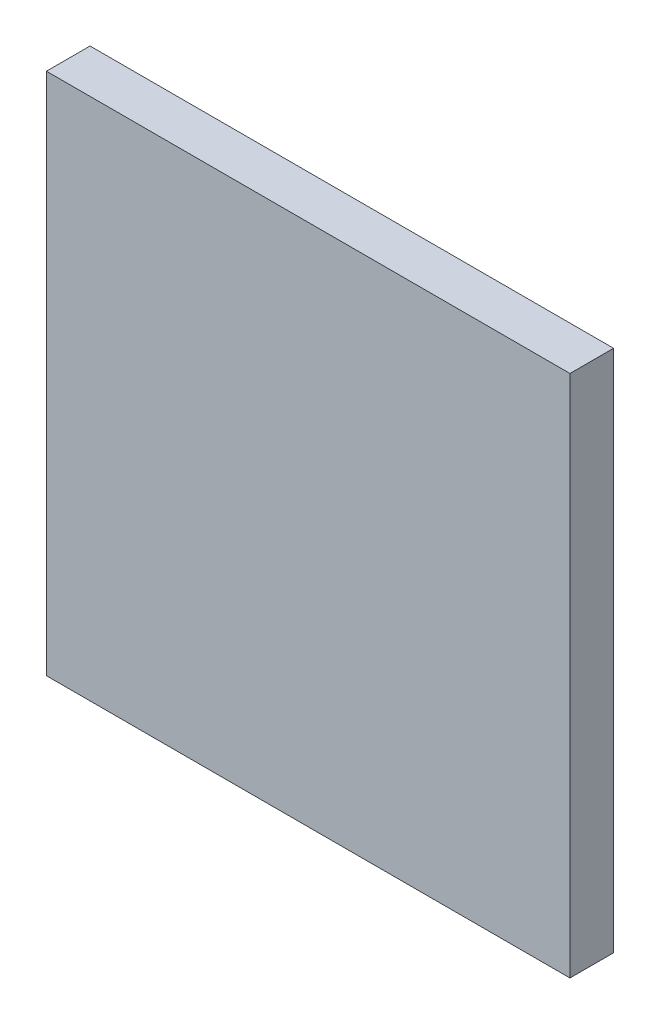
ISO-10303-21;
HEADER;
FILE_DESCRIPTION(('STEP AP214'),'2;1');
FILE_NAME('part.step','',(''),(''),'','','');
FILE_SCHEMA(('AUTOMOTIVE_DESIGN { 1 0 10303 214 1 1 1 1 }'));
ENDSEC;
DATA;
#1=APPLICATION_CONTEXT('core data for automotive mechanical design processes');
#2=APPLICATION_PROTOCOL_DEFINITION('international standard','automotive_design',2000,#1);
#3=PRODUCT_CONTEXT('',#1,'mechanical');
#4=PRODUCT('Part','Part','',(#3));
#5=PRODUCT_RELATED_PRODUCT_CATEGORY('part','',(#4));
#6=PRODUCT_DEFINITION_FORMATION('','',#4);
#7=PRODUCT_DEFINITION_CONTEXT('part definition',#1,'design');
#8=PRODUCT_DEFINITION('design','',#6,#7);
#9=PRODUCT_DEFINITION_SHAPE('','',#8);
#10=(LENGTH_UNIT() NAMED_UNIT(*) SI_UNIT(.MILLI.,.METRE.));
#11=(NAMED_UNIT(*) PLANE_ANGLE_UNIT() SI_UNIT($,.RADIAN.));
#12=(NAMED_UNIT(*) SI_UNIT($,.STERADIAN.) SOLID_ANGLE_UNIT());
#13=UNCERTAINTY_MEASURE_WITH_UNIT(LENGTH_MEASURE(1.E-05),#10,'distance_accuracy_value','');
#14=(GEOMETRIC_REPRESENTATION_CONTEXT(3) GLOBAL_UNCERTAINTY_ASSIGNED_CONTEXT((#13)) GLOBAL_UNIT_ASSIGNED_CONTEXT((#10,
#11,#12)) REPRESENTATION_CONTEXT('',''));
#15=CARTESIAN_POINT('',(0.,0.,0.));
#16=DIRECTION('',(0.,0.,1.));
#17=DIRECTION('',(1.,0.,0.));
#18=AXIS2_PLACEMENT_3D('',#15,#16,#17);
#19=CARTESIAN_POINT('',(0.,0.,-0.5));
#20=DIRECTION('',(-1.,0.,0.));
#21=DIRECTION('',(0.,0.,1.));
#22=AXIS2_PLACEMENT_3D('',#19,#20,#21);
#23=PLANE('',#22);
#24=DIRECTION('',(0.,-1.,0.));
#25=VECTOR('',#24,1.);
#26=CARTESIAN_POINT('',(0.,0.,0.));
#27=LINE('',#26,#25);
#28=CARTESIAN_POINT('',(0.,6.00000000000001,0.));
#29=VERTEX_POINT('',#28);
#30=CARTESIAN_POINT('',(0.,0.,0.));
#31=VERTEX_POINT('',#30);
#32=EDGE_CURVE('E103',#29,#31,#27,.T.);
#33=ORIENTED_EDGE('',*,*,#32,.F.);
#34=DIRECTION('',(0.,0.,1.));
#35=VECTOR('',#34,1.);
#36=CARTESIAN_POINT('',(0.,6.00000000000001,-0.5));
#37=LINE('',#36,#35);
#38=CARTESIAN_POINT('',(0.,6.00000000000001,-0.5));
#39=VERTEX_POINT('',#38);
#40=EDGE_CURVE('E11',#39,#29,#37,.T.);
#41=ORIENTED_EDGE('',*,*,#40,.F.);
#42=DIRECTION('',(0.,-1.,0.));
#43=VECTOR('',#42,1.);
#44=CARTESIAN_POINT('',(0.,0.,-0.5));
#45=LINE('',#44,#43);
#46=CARTESIAN_POINT('',(0.,0.,-0.5));
#47=VERTEX_POINT('',#46);
#48=EDGE_CURVE('E97',#39,#47,#45,.T.);
#49=ORIENTED_EDGE('',*,*,#48,.T.);
#50=DIRECTION('',(0.,0.,1.));
#51=VECTOR('',#50,1.);
#52=CARTESIAN_POINT('',(0.,0.,-0.5));
#53=LINE('',#52,#51);
#54=EDGE_CURVE('E42',#47,#31,#53,.T.);
#55=ORIENTED_EDGE('',*,*,#54,.T.);
#56=EDGE_LOOP('',(#33,#41,#49,#55));
#57=FACE_BOUND('',#56,.T.);
#58=ADVANCED_FACE('F39',(#57),#23,.T.);
#59=CARTESIAN_POINT('',(0.,6.00000000000001,-0.5));
#60=DIRECTION('',(0.,1.,0.));
#61=DIRECTION('',(0.,0.,1.));
#62=AXIS2_PLACEMENT_3D('',#59,#60,#61);
#63=PLANE('',#62);
#64=DIRECTION('',(-1.,0.,0.));
#65=VECTOR('',#64,1.);
#66=CARTESIAN_POINT('',(0.,6.00000000000001,0.));
#67=LINE('',#66,#65);
#68=CARTESIAN_POINT('',(6.,6.00000000000001,0.));
#69=VERTEX_POINT('',#68);
#70=EDGE_CURVE('E99',#69,#29,#67,.T.);
#71=ORIENTED_EDGE('',*,*,#70,.F.);
#72=DIRECTION('',(0.,0.,1.));
#73=VECTOR('',#72,1.);
#74=CARTESIAN_POINT('',(6.,6.00000000000001,-0.5));
#75=LINE('',#74,#73);
#76=CARTESIAN_POINT('',(6.,6.00000000000001,-0.5));
#77=VERTEX_POINT('',#76);
#78=EDGE_CURVE('E48',#77,#69,#75,.T.);
#79=ORIENTED_EDGE('',*,*,#78,.F.);
#80=DIRECTION('',(-1.,0.,0.));
#81=VECTOR('',#80,1.);
#82=CARTESIAN_POINT('',(0.,6.00000000000001,-0.5));
#83=LINE('',#82,#81);
#84=EDGE_CURVE('E94',#77,#39,#83,.T.);
#85=ORIENTED_EDGE('',*,*,#84,.T.);
#86=ORIENTED_EDGE('',*,*,#40,.T.);
#87=EDGE_LOOP('',(#71,#79,#85,#86));
#88=FACE_BOUND('',#87,.T.);
#89=ADVANCED_FACE('F113',(#88),#63,.T.);
#90=CARTESIAN_POINT('',(6.00000000000001,0.,-0.5));
#91=DIRECTION('',(1.,0.,0.));
#92=DIRECTION('',(0.,1.,0.));
#93=AXIS2_PLACEMENT_3D('',#90,#91,#92);
#94=PLANE('',#93);
#95=DIRECTION('',(0.,1.,0.));
#96=VECTOR('',#95,1.);
#97=CARTESIAN_POINT('',(6.00000000000001,0.,0.));
#98=LINE('',#97,#96);
#99=CARTESIAN_POINT('',(6.00000000000001,0.,0.));
#100=VERTEX_POINT('',#99);
#101=EDGE_CURVE('E89',#100,#69,#98,.T.);
#102=ORIENTED_EDGE('',*,*,#101,.F.);
#103=DIRECTION('',(0.,0.,1.));
#104=VECTOR('',#103,1.);
#105=CARTESIAN_POINT('',(6.00000000000001,0.,-0.5));
#106=LINE('',#105,#104);
#107=CARTESIAN_POINT('',(6.00000000000001,0.,-0.5));
#108=VERTEX_POINT('',#107);
#109=EDGE_CURVE('E84',#108,#100,#106,.T.);
#110=ORIENTED_EDGE('',*,*,#109,.F.);
#111=DIRECTION('',(0.,1.,0.));
#112=VECTOR('',#111,1.);
#113=CARTESIAN_POINT('',(6.00000000000001,0.,-0.5));
#114=LINE('',#113,#112);
#115=EDGE_CURVE('E87',#108,#77,#114,.T.);
#116=ORIENTED_EDGE('',*,*,#115,.T.);
#117=ORIENTED_EDGE('',*,*,#78,.T.);
#118=EDGE_LOOP('',(#102,#110,#116,#117));
#119=FACE_BOUND('',#118,.T.);
#120=ADVANCED_FACE('F86',(#119),#94,.T.);
#121=CARTESIAN_POINT('',(0.,0.,-0.5));
#122=DIRECTION('',(0.,-1.,0.));
#123=DIRECTION('',(0.,0.,-1.));
#124=AXIS2_PLACEMENT_3D('',#121,#122,#123);
#125=PLANE('',#124);
#126=DIRECTION('',(1.,0.,0.));
#127=VECTOR('',#126,1.);
#128=CARTESIAN_POINT('',(0.,0.,0.));
#129=LINE('',#128,#127);
#130=EDGE_CURVE('E106',#31,#100,#129,.T.);
#131=ORIENTED_EDGE('',*,*,#130,.F.);
#132=ORIENTED_EDGE('',*,*,#54,.F.);
#133=DIRECTION('',(1.,0.,0.));
#134=VECTOR('',#133,1.);
#135=CARTESIAN_POINT('',(0.,0.,-0.5));
#136=LINE('',#135,#134);
#137=EDGE_CURVE('E93',#47,#108,#136,.T.);
#138=ORIENTED_EDGE('',*,*,#137,.T.);
#139=ORIENTED_EDGE('',*,*,#109,.T.);
#140=EDGE_LOOP('',(#131,#132,#138,#139));
#141=FACE_BOUND('',#140,.T.);
#142=ADVANCED_FACE('F96',(#141),#125,.T.);
#143=CARTESIAN_POINT('',(0.,6.00000000000001,-0.5));
#144=DIRECTION('',(0.,0.,-1.));
#145=DIRECTION('',(-1.,0.,0.));
#146=AXIS2_PLACEMENT_3D('',#143,#144,#145);
#147=PLANE('',#146);
#148=ORIENTED_EDGE('',*,*,#48,.F.);
#149=ORIENTED_EDGE('',*,*,#84,.F.);
#150=ORIENTED_EDGE('',*,*,#115,.F.);
#151=ORIENTED_EDGE('',*,*,#137,.F.);
#152=EDGE_LOOP('',(#148,#149,#150,#151));
#153=FACE_BOUND('',#152,.T.);
#154=ADVANCED_FACE('F92',(#153),#147,.T.);
#155=CARTESIAN_POINT('',(0.,6.00000000000001,0.));
#156=DIRECTION('',(0.,0.,-1.));
#157=DIRECTION('',(-1.,0.,0.));
#158=AXIS2_PLACEMENT_3D('',#155,#156,#157);
#159=PLANE('',#158);
#160=ORIENTED_EDGE('',*,*,#32,.T.);
#161=ORIENTED_EDGE('',*,*,#130,.T.);
#162=ORIENTED_EDGE('',*,*,#101,.T.);
#163=ORIENTED_EDGE('',*,*,#70,.T.);
#164=EDGE_LOOP('',(#160,#161,#162,#163));
#165=FACE_BOUND('',#164,.T.);
#166=ADVANCED_FACE('F112',(#165),#159,.F.);
#167=CLOSED_SHELL('',(#58,#89,#120,#142,#154,#166));
#168=MANIFOLD_SOLID_BREP('B2',#167);
#169=ADVANCED_BREP_SHAPE_REPRESENTATION('',(#18,#168),#14);
#170=SHAPE_DEFINITION_REPRESENTATION(#9,#169);
ENDSEC;
END-ISO-10303-21;
